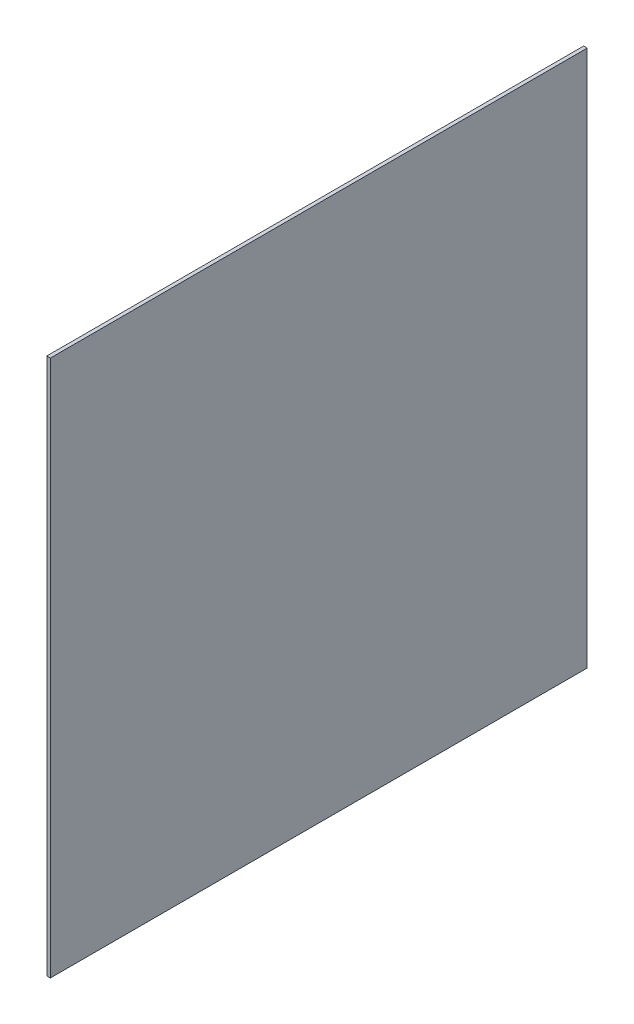
ISO-10303-21;
HEADER;
FILE_DESCRIPTION(('STEP AP214'),'2;1');
FILE_NAME('part.step','',(''),(''),'','','');
FILE_SCHEMA(('AUTOMOTIVE_DESIGN { 1 0 10303 214 1 1 1 1 }'));
ENDSEC;
DATA;
#1=APPLICATION_CONTEXT('core data for automotive mechanical design processes');
#2=APPLICATION_PROTOCOL_DEFINITION('international standard','automotive_design',2000,#1);
#3=PRODUCT_CONTEXT('',#1,'mechanical');
#4=PRODUCT('Part','Part','',(#3));
#5=PRODUCT_RELATED_PRODUCT_CATEGORY('part','',(#4));
#6=PRODUCT_DEFINITION_FORMATION('','',#4);
#7=PRODUCT_DEFINITION_CONTEXT('part definition',#1,'design');
#8=PRODUCT_DEFINITION('design','',#6,#7);
#9=PRODUCT_DEFINITION_SHAPE('','',#8);
#10=(LENGTH_UNIT() NAMED_UNIT(*) SI_UNIT(.MILLI.,.METRE.));
#11=(NAMED_UNIT(*) PLANE_ANGLE_UNIT() SI_UNIT($,.RADIAN.));
#12=(NAMED_UNIT(*) SI_UNIT($,.STERADIAN.) SOLID_ANGLE_UNIT());
#13=UNCERTAINTY_MEASURE_WITH_UNIT(LENGTH_MEASURE(1.E-05),#10,'distance_accuracy_value','');
#14=(GEOMETRIC_REPRESENTATION_CONTEXT(3) GLOBAL_UNCERTAINTY_ASSIGNED_CONTEXT((#13)) GLOBAL_UNIT_ASSIGNED_CONTEXT((#10,
#11,#12)) REPRESENTATION_CONTEXT('',''));
#15=CARTESIAN_POINT('',(0.,0.,0.));
#16=DIRECTION('',(0.,0.,1.));
#17=DIRECTION('',(1.,0.,0.));
#18=AXIS2_PLACEMENT_3D('',#15,#16,#17);
#19=CARTESIAN_POINT('',(-10.,0.,0.));
#20=DIRECTION('',(-1.,0.,0.));
#21=DIRECTION('',(0.,0.,1.));
#22=AXIS2_PLACEMENT_3D('',#19,#20,#21);
#23=PLANE('',#22);
#24=DIRECTION('',(0.,0.,-1.));
#25=VECTOR('',#24,1.);
#26=CARTESIAN_POINT('',(-10.,-378.710653275796,777.274991403029));
#27=LINE('',#26,#25);
#28=CARTESIAN_POINT('',(-10.,-378.710653275796,777.274991403029));
#29=VERTEX_POINT('',#28);
#30=CARTESIAN_POINT('',(-10.,-378.710653275796,-722.725008596971));
#31=VERTEX_POINT('',#30);
#32=EDGE_CURVE('E45',#29,#31,#27,.T.);
#33=ORIENTED_EDGE('',*,*,#32,.T.);
#34=DIRECTION('',(0.,-1.,0.));
#35=VECTOR('',#34,1.);
#36=CARTESIAN_POINT('',(-10.,1121.2893467242,-722.725008596971));
#37=LINE('',#36,#35);
#38=CARTESIAN_POINT('',(-10.,1121.2893467242,-722.725008596971));
#39=VERTEX_POINT('',#38);
#40=EDGE_CURVE('E79',#39,#31,#37,.T.);
#41=ORIENTED_EDGE('',*,*,#40,.F.);
#42=DIRECTION('',(0.,0.,-1.));
#43=VECTOR('',#42,1.);
#44=CARTESIAN_POINT('',(-10.,1121.2893467242,777.274991403029));
#45=LINE('',#44,#43);
#46=CARTESIAN_POINT('',(-10.,1121.2893467242,777.274991403029));
#47=VERTEX_POINT('',#46);
#48=EDGE_CURVE('E76',#47,#39,#45,.T.);
#49=ORIENTED_EDGE('',*,*,#48,.F.);
#50=DIRECTION('',(0.,-1.,0.));
#51=VECTOR('',#50,1.);
#52=CARTESIAN_POINT('',(-10.,1121.2893467242,777.274991403029));
#53=LINE('',#52,#51);
#54=EDGE_CURVE('E73',#47,#29,#53,.T.);
#55=ORIENTED_EDGE('',*,*,#54,.T.);
#56=EDGE_LOOP('',(#33,#41,#49,#55));
#57=FACE_BOUND('',#56,.T.);
#58=ADVANCED_FACE('F36',(#57),#23,.F.);
#59=CARTESIAN_POINT('',(-20.,0.,0.));
#60=DIRECTION('',(-1.,0.,0.));
#61=DIRECTION('',(0.,0.,1.));
#62=AXIS2_PLACEMENT_3D('',#59,#60,#61);
#63=PLANE('',#62);
#64=DIRECTION('',(0.,0.,-1.));
#65=VECTOR('',#64,1.);
#66=CARTESIAN_POINT('',(-20.,-378.710653275796,777.274991403029));
#67=LINE('',#66,#65);
#68=CARTESIAN_POINT('',(-20.,-378.710653275796,777.274991403029));
#69=VERTEX_POINT('',#68);
#70=CARTESIAN_POINT('',(-20.,-378.710653275796,-722.725008596971));
#71=VERTEX_POINT('',#70);
#72=EDGE_CURVE('E12',#69,#71,#67,.T.);
#73=ORIENTED_EDGE('',*,*,#72,.F.);
#74=DIRECTION('',(0.,-1.,0.));
#75=VECTOR('',#74,1.);
#76=CARTESIAN_POINT('',(-20.,1121.2893467242,777.274991403029));
#77=LINE('',#76,#75);
#78=CARTESIAN_POINT('',(-20.,1121.2893467242,777.274991403029));
#79=VERTEX_POINT('',#78);
#80=EDGE_CURVE('E92',#79,#69,#77,.T.);
#81=ORIENTED_EDGE('',*,*,#80,.F.);
#82=DIRECTION('',(0.,0.,-1.));
#83=VECTOR('',#82,1.);
#84=CARTESIAN_POINT('',(-20.,1121.2893467242,777.274991403029));
#85=LINE('',#84,#83);
#86=CARTESIAN_POINT('',(-20.,1121.2893467242,-722.725008596971));
#87=VERTEX_POINT('',#86);
#88=EDGE_CURVE('E83',#79,#87,#85,.T.);
#89=ORIENTED_EDGE('',*,*,#88,.T.);
#90=DIRECTION('',(0.,-1.,0.));
#91=VECTOR('',#90,1.);
#92=CARTESIAN_POINT('',(-20.,1121.2893467242,-722.725008596971));
#93=LINE('',#92,#91);
#94=EDGE_CURVE('E54',#87,#71,#93,.T.);
#95=ORIENTED_EDGE('',*,*,#94,.T.);
#96=EDGE_LOOP('',(#73,#81,#89,#95));
#97=FACE_BOUND('',#96,.T.);
#98=ADVANCED_FACE('F132',(#97),#63,.T.);
#99=CARTESIAN_POINT('',(-20.,1121.2893467242,777.274991403029));
#100=DIRECTION('',(0.,0.,1.));
#101=DIRECTION('',(1.,0.,0.));
#102=AXIS2_PLACEMENT_3D('',#99,#100,#101);
#103=PLANE('',#102);
#104=ORIENTED_EDGE('',*,*,#54,.F.);
#105=DIRECTION('',(1.,0.,0.));
#106=VECTOR('',#105,1.);
#107=CARTESIAN_POINT('',(-20.,1121.2893467242,777.274991403029));
#108=LINE('',#107,#106);
#109=EDGE_CURVE('E88',#79,#47,#108,.T.);
#110=ORIENTED_EDGE('',*,*,#109,.F.);
#111=ORIENTED_EDGE('',*,*,#80,.T.);
#112=DIRECTION('',(1.,0.,0.));
#113=VECTOR('',#112,1.);
#114=CARTESIAN_POINT('',(-20.,-378.710653275796,777.274991403029));
#115=LINE('',#114,#113);
#116=EDGE_CURVE('E84',#69,#29,#115,.T.);
#117=ORIENTED_EDGE('',*,*,#116,.T.);
#118=EDGE_LOOP('',(#104,#110,#111,#117));
#119=FACE_BOUND('',#118,.T.);
#120=ADVANCED_FACE('F93',(#119),#103,.T.);
#121=CARTESIAN_POINT('',(-20.,-378.710653275796,777.274991403029));
#122=DIRECTION('',(0.,-1.,0.));
#123=DIRECTION('',(0.,0.,-1.));
#124=AXIS2_PLACEMENT_3D('',#121,#122,#123);
#125=PLANE('',#124);
#126=ORIENTED_EDGE('',*,*,#32,.F.);
#127=ORIENTED_EDGE('',*,*,#116,.F.);
#128=ORIENTED_EDGE('',*,*,#72,.T.);
#129=DIRECTION('',(1.,0.,0.));
#130=VECTOR('',#129,1.);
#131=CARTESIAN_POINT('',(-20.,-378.710653275796,-722.725008596971));
#132=LINE('',#131,#130);
#133=EDGE_CURVE('E104',#71,#31,#132,.T.);
#134=ORIENTED_EDGE('',*,*,#133,.T.);
#135=EDGE_LOOP('',(#126,#127,#128,#134));
#136=FACE_BOUND('',#135,.T.);
#137=ADVANCED_FACE('F134',(#136),#125,.T.);
#138=CARTESIAN_POINT('',(-20.,1121.2893467242,777.274991403029));
#139=DIRECTION('',(0.,-1.,0.));
#140=DIRECTION('',(0.,0.,-1.));
#141=AXIS2_PLACEMENT_3D('',#138,#139,#140);
#142=PLANE('',#141);
#143=ORIENTED_EDGE('',*,*,#48,.T.);
#144=DIRECTION('',(1.,0.,0.));
#145=VECTOR('',#144,1.);
#146=CARTESIAN_POINT('',(-20.,1121.2893467242,-722.725008596971));
#147=LINE('',#146,#145);
#148=EDGE_CURVE('E108',#87,#39,#147,.T.);
#149=ORIENTED_EDGE('',*,*,#148,.F.);
#150=ORIENTED_EDGE('',*,*,#88,.F.);
#151=ORIENTED_EDGE('',*,*,#109,.T.);
#152=EDGE_LOOP('',(#143,#149,#150,#151));
#153=FACE_BOUND('',#152,.T.);
#154=ADVANCED_FACE('F89',(#153),#142,.F.);
#155=CARTESIAN_POINT('',(-20.,1121.2893467242,-722.725008596971));
#156=DIRECTION('',(0.,0.,1.));
#157=DIRECTION('',(1.,0.,0.));
#158=AXIS2_PLACEMENT_3D('',#155,#156,#157);
#159=PLANE('',#158);
#160=ORIENTED_EDGE('',*,*,#40,.T.);
#161=ORIENTED_EDGE('',*,*,#133,.F.);
#162=ORIENTED_EDGE('',*,*,#94,.F.);
#163=ORIENTED_EDGE('',*,*,#148,.T.);
#164=EDGE_LOOP('',(#160,#161,#162,#163));
#165=FACE_BOUND('',#164,.T.);
#166=ADVANCED_FACE('F119',(#165),#159,.F.);
#167=CLOSED_SHELL('',(#58,#98,#120,#137,#154,#166));
#168=MANIFOLD_SOLID_BREP('B2',#167);
#169=ADVANCED_BREP_SHAPE_REPRESENTATION('',(#18,#168),#14);
#170=SHAPE_DEFINITION_REPRESENTATION(#9,#169);
ENDSEC;
END-ISO-10303-21;
